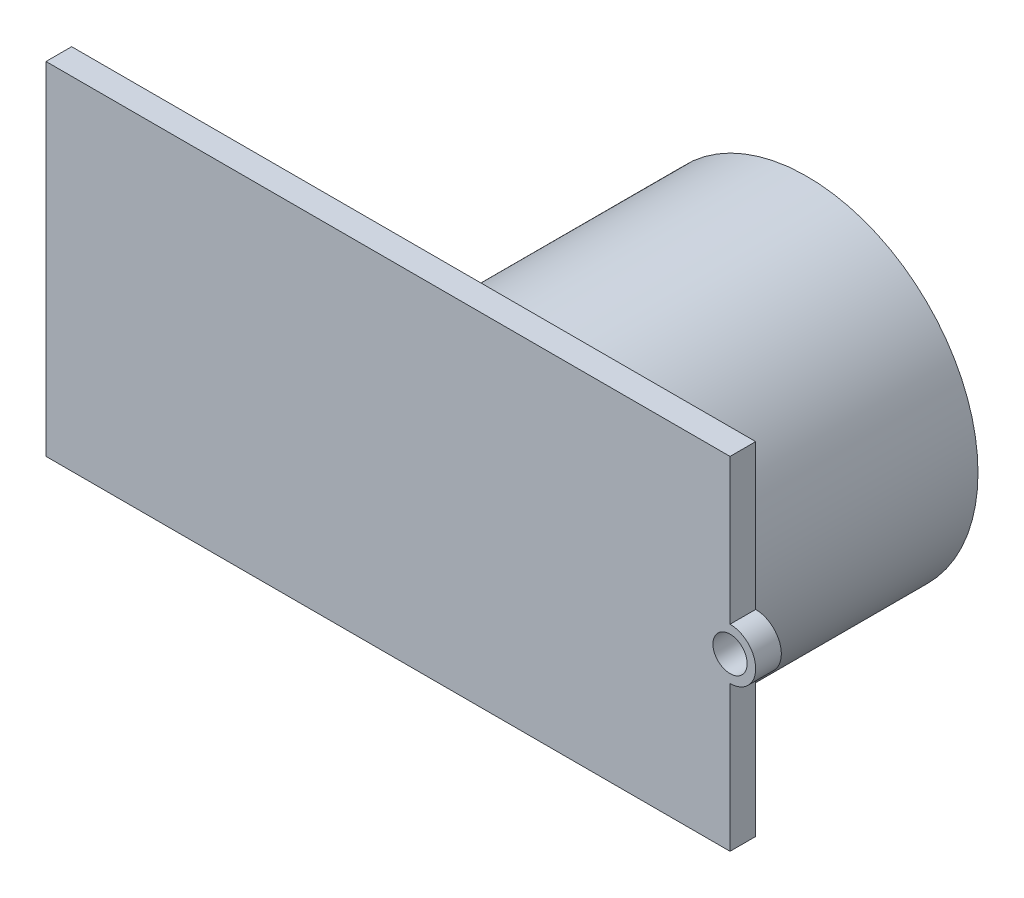
ISO-10303-21;
HEADER;
FILE_DESCRIPTION(('STEP AP214'),'2;1');
FILE_NAME('part.step','',(''),(''),'','','');
FILE_SCHEMA(('AUTOMOTIVE_DESIGN { 1 0 10303 214 1 1 1 1 }'));
ENDSEC;
DATA;
#1=APPLICATION_CONTEXT('core data for automotive mechanical design processes');
#2=APPLICATION_PROTOCOL_DEFINITION('international standard','automotive_design',2000,#1);
#3=PRODUCT_CONTEXT('',#1,'mechanical');
#4=PRODUCT('Part','Part','',(#3));
#5=PRODUCT_RELATED_PRODUCT_CATEGORY('part','',(#4));
#6=PRODUCT_DEFINITION_FORMATION('','',#4);
#7=PRODUCT_DEFINITION_CONTEXT('part definition',#1,'design');
#8=PRODUCT_DEFINITION('design','',#6,#7);
#9=PRODUCT_DEFINITION_SHAPE('','',#8);
#10=(LENGTH_UNIT() NAMED_UNIT(*) SI_UNIT(.MILLI.,.METRE.));
#11=(NAMED_UNIT(*) PLANE_ANGLE_UNIT() SI_UNIT($,.RADIAN.));
#12=(NAMED_UNIT(*) SI_UNIT($,.STERADIAN.) SOLID_ANGLE_UNIT());
#13=UNCERTAINTY_MEASURE_WITH_UNIT(LENGTH_MEASURE(1.E-05),#10,'distance_accuracy_value','');
#14=(GEOMETRIC_REPRESENTATION_CONTEXT(3) GLOBAL_UNCERTAINTY_ASSIGNED_CONTEXT((#13)) GLOBAL_UNIT_ASSIGNED_CONTEXT((#10,
#11,#12)) REPRESENTATION_CONTEXT('',''));
#15=CARTESIAN_POINT('',(0.,0.,0.));
#16=DIRECTION('',(0.,0.,1.));
#17=DIRECTION('',(1.,0.,0.));
#18=AXIS2_PLACEMENT_3D('',#15,#16,#17);
#19=CARTESIAN_POINT('',(20.277172368047,0.115606936416188,0.));
#20=DIRECTION('',(0.,0.,-1.));
#21=DIRECTION('',(-1.,0.,0.));
#22=AXIS2_PLACEMENT_3D('',#19,#20,#21);
#23=PLANE('',#22);
#24=CARTESIAN_POINT('',(20.277172368047,0.115606936416188,0.));
#25=DIRECTION('',(0.,0.,1.));
#26=DIRECTION('',(1.,0.,0.));
#27=AXIS2_PLACEMENT_3D('',#24,#25,#26);
#28=CIRCLE('',#27,1.);
#29=CARTESIAN_POINT('',(21.277172368047,0.115606936416188,0.));
#30=VERTEX_POINT('',#29);
#31=EDGE_CURVE('E165',#30,#30,#28,.T.);
#32=ORIENTED_EDGE('',*,*,#31,.T.);
#33=EDGE_LOOP('',(#32));
#34=FACE_BOUND('',#33,.T.);
#35=DIRECTION('',(1.,0.,0.));
#36=VECTOR('',#35,1.);
#37=CARTESIAN_POINT('',(-19.722827631953,-9.88439306358381,0.));
#38=LINE('',#37,#36);
#39=CARTESIAN_POINT('',(9.44492210958932,-9.88439306358381,0.));
#40=VERTEX_POINT('',#39);
#41=CARTESIAN_POINT('',(20.277172368047,-9.88439306358381,0.));
#42=VERTEX_POINT('',#41);
#43=EDGE_CURVE('E133',#40,#42,#38,.T.);
#44=ORIENTED_EDGE('',*,*,#43,.F.);
#45=CARTESIAN_POINT('',(8.277172368047,0.0471909259481629,0.));
#46=DIRECTION('',(0.,0.,1.));
#47=DIRECTION('',(1.,0.,0.));
#48=AXIS2_PLACEMENT_3D('',#45,#46,#47);
#49=CIRCLE('',#48,10.);
#50=CARTESIAN_POINT('',(7.10942262650468,-9.88439306358381,0.));
#51=VERTEX_POINT('',#50);
#52=EDGE_CURVE('E11',#40,#51,#49,.T.);
#53=ORIENTED_EDGE('',*,*,#52,.T.);
#54=CARTESIAN_POINT('',(-19.722827631953,-9.88439306358381,0.));
#55=VERTEX_POINT('',#54);
#56=EDGE_CURVE('E135',#55,#51,#38,.T.);
#57=ORIENTED_EDGE('',*,*,#56,.F.);
#58=DIRECTION('',(0.,-1.,0.));
#59=VECTOR('',#58,1.);
#60=CARTESIAN_POINT('',(-19.722827631953,10.1156069364162,0.));
#61=LINE('',#60,#59);
#62=CARTESIAN_POINT('',(-19.722827631953,10.1156069364162,0.));
#63=VERTEX_POINT('',#62);
#64=EDGE_CURVE('E130',#63,#55,#61,.T.);
#65=ORIENTED_EDGE('',*,*,#64,.F.);
#66=DIRECTION('',(-1.,0.,0.));
#67=VECTOR('',#66,1.);
#68=CARTESIAN_POINT('',(-19.722827631953,10.1156069364162,0.));
#69=LINE('',#68,#67);
#70=CARTESIAN_POINT('',(20.277172368047,10.1156069364162,0.));
#71=VERTEX_POINT('',#70);
#72=EDGE_CURVE('E84',#71,#63,#69,.T.);
#73=ORIENTED_EDGE('',*,*,#72,.F.);
#74=DIRECTION('',(0.,1.,0.));
#75=VECTOR('',#74,1.);
#76=CARTESIAN_POINT('',(20.277172368047,1.6156069364162,0.));
#77=LINE('',#76,#75);
#78=CARTESIAN_POINT('',(20.277172368047,1.6156069364162,0.));
#79=VERTEX_POINT('',#78);
#80=EDGE_CURVE('E142',#79,#71,#77,.T.);
#81=ORIENTED_EDGE('',*,*,#80,.F.);
#82=CARTESIAN_POINT('',(20.277172368047,0.115606936416188,0.));
#83=DIRECTION('',(0.,0.,1.));
#84=DIRECTION('',(-1.,0.,0.));
#85=AXIS2_PLACEMENT_3D('',#82,#83,#84);
#86=CIRCLE('',#85,1.5);
#87=CARTESIAN_POINT('',(20.277172368047,-1.38439306358381,0.));
#88=VERTEX_POINT('',#87);
#89=EDGE_CURVE('E118',#88,#79,#86,.T.);
#90=ORIENTED_EDGE('',*,*,#89,.F.);
#91=DIRECTION('',(0.,1.,0.));
#92=VECTOR('',#91,1.);
#93=CARTESIAN_POINT('',(20.277172368047,-9.88439306358381,0.));
#94=LINE('',#93,#92);
#95=EDGE_CURVE('E138',#42,#88,#94,.T.);
#96=ORIENTED_EDGE('',*,*,#95,.F.);
#97=EDGE_LOOP('',(#44,#53,#57,#65,#73,#81,#90,#96));
#98=FACE_BOUND('',#97,.T.);
#99=ADVANCED_FACE('F33',(#34,#98),#23,.T.);
#100=CARTESIAN_POINT('',(20.277172368047,0.115606936416188,1.5));
#101=DIRECTION('',(0.,0.,-1.));
#102=DIRECTION('',(-1.,0.,0.));
#103=AXIS2_PLACEMENT_3D('',#100,#101,#102);
#104=PLANE('',#103);
#105=DIRECTION('',(0.,-1.,0.));
#106=VECTOR('',#105,1.);
#107=CARTESIAN_POINT('',(-19.722827631953,10.1156069364162,1.5));
#108=LINE('',#107,#106);
#109=CARTESIAN_POINT('',(-19.722827631953,10.1156069364162,1.5));
#110=VERTEX_POINT('',#109);
#111=CARTESIAN_POINT('',(-19.722827631953,-9.88439306358381,1.5));
#112=VERTEX_POINT('',#111);
#113=EDGE_CURVE('E145',#110,#112,#108,.T.);
#114=ORIENTED_EDGE('',*,*,#113,.T.);
#115=DIRECTION('',(1.,0.,0.));
#116=VECTOR('',#115,1.);
#117=CARTESIAN_POINT('',(-19.722827631953,-9.88439306358381,1.5));
#118=LINE('',#117,#116);
#119=CARTESIAN_POINT('',(20.277172368047,-9.88439306358381,1.5));
#120=VERTEX_POINT('',#119);
#121=EDGE_CURVE('E93',#112,#120,#118,.T.);
#122=ORIENTED_EDGE('',*,*,#121,.T.);
#123=DIRECTION('',(0.,1.,0.));
#124=VECTOR('',#123,1.);
#125=CARTESIAN_POINT('',(20.277172368047,-9.88439306358381,1.5));
#126=LINE('',#125,#124);
#127=CARTESIAN_POINT('',(20.277172368047,-1.38439306358381,1.5));
#128=VERTEX_POINT('',#127);
#129=EDGE_CURVE('E109',#120,#128,#126,.T.);
#130=ORIENTED_EDGE('',*,*,#129,.T.);
#131=CARTESIAN_POINT('',(20.277172368047,0.115606936416188,1.5));
#132=DIRECTION('',(0.,0.,1.));
#133=DIRECTION('',(-1.,0.,0.));
#134=AXIS2_PLACEMENT_3D('',#131,#132,#133);
#135=CIRCLE('',#134,1.5);
#136=CARTESIAN_POINT('',(20.277172368047,1.6156069364162,1.5));
#137=VERTEX_POINT('',#136);
#138=EDGE_CURVE('E101',#128,#137,#135,.T.);
#139=ORIENTED_EDGE('',*,*,#138,.T.);
#140=DIRECTION('',(0.,1.,0.));
#141=VECTOR('',#140,1.);
#142=CARTESIAN_POINT('',(20.277172368047,1.6156069364162,1.5));
#143=LINE('',#142,#141);
#144=CARTESIAN_POINT('',(20.277172368047,10.1156069364162,1.5));
#145=VERTEX_POINT('',#144);
#146=EDGE_CURVE('E106',#137,#145,#143,.T.);
#147=ORIENTED_EDGE('',*,*,#146,.T.);
#148=DIRECTION('',(-1.,0.,0.));
#149=VECTOR('',#148,1.);
#150=CARTESIAN_POINT('',(-19.722827631953,10.1156069364162,1.5));
#151=LINE('',#150,#149);
#152=EDGE_CURVE('E57',#145,#110,#151,.T.);
#153=ORIENTED_EDGE('',*,*,#152,.T.);
#154=EDGE_LOOP('',(#114,#122,#130,#139,#147,#153));
#155=FACE_BOUND('',#154,.T.);
#156=CARTESIAN_POINT('',(20.277172368047,0.115606936416188,1.5));
#157=DIRECTION('',(0.,0.,1.));
#158=DIRECTION('',(1.,0.,0.));
#159=AXIS2_PLACEMENT_3D('',#156,#157,#158);
#160=CIRCLE('',#159,1.);
#161=CARTESIAN_POINT('',(21.277172368047,0.115606936416188,1.5));
#162=VERTEX_POINT('',#161);
#163=EDGE_CURVE('E134',#162,#162,#160,.T.);
#164=ORIENTED_EDGE('',*,*,#163,.F.);
#165=EDGE_LOOP('',(#164));
#166=FACE_BOUND('',#165,.T.);
#167=ADVANCED_FACE('F103',(#155,#166),#104,.F.);
#168=CARTESIAN_POINT('',(-19.722827631953,10.1156069364162,1.5));
#169=DIRECTION('',(1.,0.,0.));
#170=DIRECTION('',(0.,1.,0.));
#171=AXIS2_PLACEMENT_3D('',#168,#169,#170);
#172=PLANE('',#171);
#173=ORIENTED_EDGE('',*,*,#64,.T.);
#174=DIRECTION('',(0.,0.,-1.));
#175=VECTOR('',#174,1.);
#176=CARTESIAN_POINT('',(-19.722827631953,-9.88439306358381,1.5));
#177=LINE('',#176,#175);
#178=EDGE_CURVE('E37',#112,#55,#177,.T.);
#179=ORIENTED_EDGE('',*,*,#178,.F.);
#180=ORIENTED_EDGE('',*,*,#113,.F.);
#181=DIRECTION('',(0.,0.,-1.));
#182=VECTOR('',#181,1.);
#183=CARTESIAN_POINT('',(-19.722827631953,10.1156069364162,1.5));
#184=LINE('',#183,#182);
#185=EDGE_CURVE('E126',#110,#63,#184,.T.);
#186=ORIENTED_EDGE('',*,*,#185,.T.);
#187=EDGE_LOOP('',(#173,#179,#180,#186));
#188=FACE_BOUND('',#187,.T.);
#189=ADVANCED_FACE('F35',(#188),#172,.F.);
#190=CARTESIAN_POINT('',(-19.722827631953,-9.88439306358381,1.5));
#191=DIRECTION('',(0.,1.,0.));
#192=DIRECTION('',(0.,0.,1.));
#193=AXIS2_PLACEMENT_3D('',#190,#191,#192);
#194=PLANE('',#193);
#195=ORIENTED_EDGE('',*,*,#56,.T.);
#196=EDGE_CURVE('E139',#51,#40,#38,.T.);
#197=ORIENTED_EDGE('',*,*,#196,.T.);
#198=ORIENTED_EDGE('',*,*,#43,.T.);
#199=DIRECTION('',(0.,0.,-1.));
#200=VECTOR('',#199,1.);
#201=CARTESIAN_POINT('',(20.277172368047,-9.88439306358381,1.5));
#202=LINE('',#201,#200);
#203=EDGE_CURVE('E148',#120,#42,#202,.T.);
#204=ORIENTED_EDGE('',*,*,#203,.F.);
#205=ORIENTED_EDGE('',*,*,#121,.F.);
#206=ORIENTED_EDGE('',*,*,#178,.T.);
#207=EDGE_LOOP('',(#195,#197,#198,#204,#205,#206));
#208=FACE_BOUND('',#207,.T.);
#209=ADVANCED_FACE('F153',(#208),#194,.F.);
#210=CARTESIAN_POINT('',(20.277172368047,-9.88439306358381,1.5));
#211=DIRECTION('',(-1.,0.,0.));
#212=DIRECTION('',(0.,-1.,0.));
#213=AXIS2_PLACEMENT_3D('',#210,#211,#212);
#214=PLANE('',#213);
#215=ORIENTED_EDGE('',*,*,#95,.T.);
#216=DIRECTION('',(0.,0.,-1.));
#217=VECTOR('',#216,1.);
#218=CARTESIAN_POINT('',(20.277172368047,-1.38439306358381,1.5));
#219=LINE('',#218,#217);
#220=EDGE_CURVE('E121',#128,#88,#219,.T.);
#221=ORIENTED_EDGE('',*,*,#220,.F.);
#222=ORIENTED_EDGE('',*,*,#129,.F.);
#223=ORIENTED_EDGE('',*,*,#203,.T.);
#224=EDGE_LOOP('',(#215,#221,#222,#223));
#225=FACE_BOUND('',#224,.T.);
#226=ADVANCED_FACE('F173',(#225),#214,.F.);
#227=CARTESIAN_POINT('',(20.277172368047,0.115606936416188,1.5));
#228=DIRECTION('',(0.,0.,-1.));
#229=DIRECTION('',(-1.,0.,0.));
#230=AXIS2_PLACEMENT_3D('',#227,#228,#229);
#231=CYLINDRICAL_SURFACE('',#230,1.5);
#232=ORIENTED_EDGE('',*,*,#89,.T.);
#233=DIRECTION('',(0.,0.,-1.));
#234=VECTOR('',#233,1.);
#235=CARTESIAN_POINT('',(20.277172368047,1.6156069364162,1.5));
#236=LINE('',#235,#234);
#237=EDGE_CURVE('E115',#137,#79,#236,.T.);
#238=ORIENTED_EDGE('',*,*,#237,.F.);
#239=ORIENTED_EDGE('',*,*,#138,.F.);
#240=ORIENTED_EDGE('',*,*,#220,.T.);
#241=EDGE_LOOP('',(#232,#238,#239,#240));
#242=FACE_BOUND('',#241,.T.);
#243=ADVANCED_FACE('F116',(#242),#231,.T.);
#244=CARTESIAN_POINT('',(20.277172368047,1.6156069364162,1.5));
#245=DIRECTION('',(-1.,0.,0.));
#246=DIRECTION('',(0.,-1.,0.));
#247=AXIS2_PLACEMENT_3D('',#244,#245,#246);
#248=PLANE('',#247);
#249=ORIENTED_EDGE('',*,*,#80,.T.);
#250=DIRECTION('',(0.,0.,-1.));
#251=VECTOR('',#250,1.);
#252=CARTESIAN_POINT('',(20.277172368047,10.1156069364162,1.5));
#253=LINE('',#252,#251);
#254=EDGE_CURVE('E122',#145,#71,#253,.T.);
#255=ORIENTED_EDGE('',*,*,#254,.F.);
#256=ORIENTED_EDGE('',*,*,#146,.F.);
#257=ORIENTED_EDGE('',*,*,#237,.T.);
#258=EDGE_LOOP('',(#249,#255,#256,#257));
#259=FACE_BOUND('',#258,.T.);
#260=ADVANCED_FACE('F124',(#259),#248,.F.);
#261=CARTESIAN_POINT('',(-19.722827631953,10.1156069364162,1.5));
#262=DIRECTION('',(0.,-1.,0.));
#263=DIRECTION('',(0.,0.,-1.));
#264=AXIS2_PLACEMENT_3D('',#261,#262,#263);
#265=PLANE('',#264);
#266=ORIENTED_EDGE('',*,*,#72,.T.);
#267=ORIENTED_EDGE('',*,*,#185,.F.);
#268=ORIENTED_EDGE('',*,*,#152,.F.);
#269=ORIENTED_EDGE('',*,*,#254,.T.);
#270=EDGE_LOOP('',(#266,#267,#268,#269));
#271=FACE_BOUND('',#270,.T.);
#272=ADVANCED_FACE('F174',(#271),#265,.F.);
#273=CARTESIAN_POINT('',(20.277172368047,0.115606936416188,1.5));
#274=DIRECTION('',(0.,0.,-1.));
#275=DIRECTION('',(-1.,0.,0.));
#276=AXIS2_PLACEMENT_3D('',#273,#274,#275);
#277=CYLINDRICAL_SURFACE('',#276,1.);
#278=ORIENTED_EDGE('',*,*,#163,.T.);
#279=EDGE_LOOP('',(#278));
#280=FACE_BOUND('',#279,.T.);
#281=ORIENTED_EDGE('',*,*,#31,.F.);
#282=EDGE_LOOP('',(#281));
#283=FACE_BOUND('',#282,.T.);
#284=ADVANCED_FACE('F176',(#280,#283),#277,.F.);
#285=CARTESIAN_POINT('',(8.277172368047,0.0471909259481629,0.));
#286=DIRECTION('',(0.,0.,1.));
#287=DIRECTION('',(1.,0.,0.));
#288=AXIS2_PLACEMENT_3D('',#285,#286,#287);
#289=PLANE('',#288);
#290=ORIENTED_EDGE('',*,*,#196,.F.);
#291=EDGE_CURVE('E43',#51,#40,#49,.T.);
#292=ORIENTED_EDGE('',*,*,#291,.T.);
#293=EDGE_LOOP('',(#290,#292));
#294=FACE_BOUND('',#293,.T.);
#295=ADVANCED_FACE('F162',(#294),#289,.T.);
#296=CARTESIAN_POINT('',(8.277172368047,0.0471909259481629,-15.));
#297=DIRECTION('',(0.,0.,1.));
#298=DIRECTION('',(1.,0.,0.));
#299=AXIS2_PLACEMENT_3D('',#296,#297,#298);
#300=CYLINDRICAL_SURFACE('',#299,10.);
#301=CARTESIAN_POINT('',(8.277172368047,0.0471909259481629,-15.));
#302=DIRECTION('',(0.,0.,1.));
#303=DIRECTION('',(1.,0.,0.));
#304=AXIS2_PLACEMENT_3D('',#301,#302,#303);
#305=CIRCLE('',#304,10.);
#306=CARTESIAN_POINT('',(18.277172368047,0.0471909259481629,-15.));
#307=VERTEX_POINT('',#306);
#308=EDGE_CURVE('E163',#307,#307,#305,.T.);
#309=ORIENTED_EDGE('',*,*,#308,.T.);
#310=EDGE_LOOP('',(#309));
#311=FACE_BOUND('',#310,.T.);
#312=ORIENTED_EDGE('',*,*,#291,.F.);
#313=ORIENTED_EDGE('',*,*,#52,.F.);
#314=EDGE_LOOP('',(#312,#313));
#315=FACE_BOUND('',#314,.T.);
#316=ADVANCED_FACE('F160',(#311,#315),#300,.T.);
#317=CARTESIAN_POINT('',(8.277172368047,0.0471909259481629,-15.));
#318=DIRECTION('',(0.,0.,1.));
#319=DIRECTION('',(1.,0.,0.));
#320=AXIS2_PLACEMENT_3D('',#317,#318,#319);
#321=PLANE('',#320);
#322=ORIENTED_EDGE('',*,*,#308,.F.);
#323=EDGE_LOOP('',(#322));
#324=FACE_BOUND('',#323,.T.);
#325=ADVANCED_FACE('F195',(#324),#321,.F.);
#326=CLOSED_SHELL('',(#99,#167,#189,#209,#226,#243,#260,#272,#284,#295,#316,#325));
#327=MANIFOLD_SOLID_BREP('B2',#326);
#328=ADVANCED_BREP_SHAPE_REPRESENTATION('',(#18,#327),#14);
#329=SHAPE_DEFINITION_REPRESENTATION(#9,#328);
ENDSEC;
END-ISO-10303-21;
